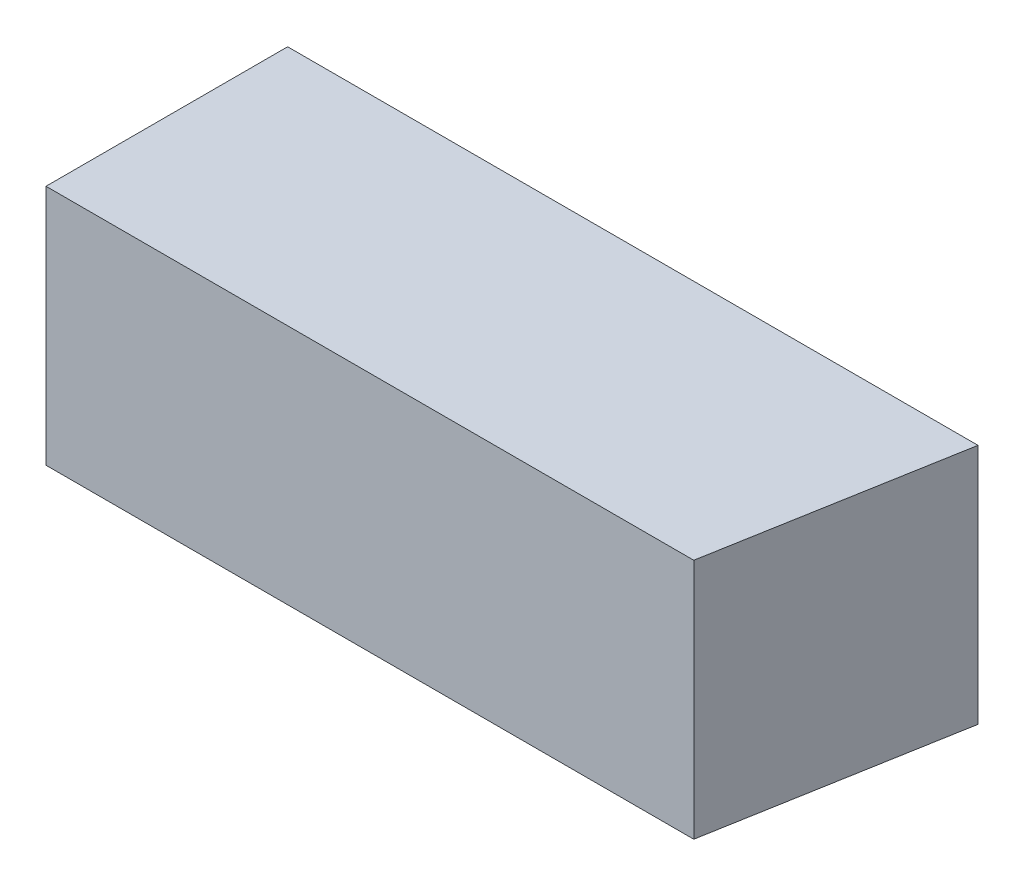
ISO-10303-21;
HEADER;
FILE_DESCRIPTION(('STEP AP214'),'2;1');
FILE_NAME('part.step','',(''),(''),'','','');
FILE_SCHEMA(('AUTOMOTIVE_DESIGN { 1 0 10303 214 1 1 1 1 }'));
ENDSEC;
DATA;
#1=APPLICATION_CONTEXT('core data for automotive mechanical design processes');
#2=APPLICATION_PROTOCOL_DEFINITION('international standard','automotive_design',2000,#1);
#3=PRODUCT_CONTEXT('',#1,'mechanical');
#4=PRODUCT('Part','Part','',(#3));
#5=PRODUCT_RELATED_PRODUCT_CATEGORY('part','',(#4));
#6=PRODUCT_DEFINITION_FORMATION('','',#4);
#7=PRODUCT_DEFINITION_CONTEXT('part definition',#1,'design');
#8=PRODUCT_DEFINITION('design','',#6,#7);
#9=PRODUCT_DEFINITION_SHAPE('','',#8);
#10=(LENGTH_UNIT() NAMED_UNIT(*) SI_UNIT(.MILLI.,.METRE.));
#11=(NAMED_UNIT(*) PLANE_ANGLE_UNIT() SI_UNIT($,.RADIAN.));
#12=(NAMED_UNIT(*) SI_UNIT($,.STERADIAN.) SOLID_ANGLE_UNIT());
#13=UNCERTAINTY_MEASURE_WITH_UNIT(LENGTH_MEASURE(1.E-05),#10,'distance_accuracy_value','');
#14=(GEOMETRIC_REPRESENTATION_CONTEXT(3) GLOBAL_UNCERTAINTY_ASSIGNED_CONTEXT((#13)) GLOBAL_UNIT_ASSIGNED_CONTEXT((#10,
#11,#12)) REPRESENTATION_CONTEXT('',''));
#15=CARTESIAN_POINT('',(0.,0.,0.));
#16=DIRECTION('',(0.,0.,1.));
#17=DIRECTION('',(1.,0.,0.));
#18=AXIS2_PLACEMENT_3D('',#15,#16,#17);
#19=CARTESIAN_POINT('',(254.,0.,0.));
#20=DIRECTION('',(0.,1.,0.));
#21=DIRECTION('',(0.,0.,1.));
#22=AXIS2_PLACEMENT_3D('',#19,#20,#21);
#23=PLANE('',#22);
#24=DIRECTION('',(-0.173622407885694,0.,0.984812296572283));
#25=VECTOR('',#24,1.);
#26=CARTESIAN_POINT('',(254.,0.,0.));
#27=LINE('',#26,#25);
#28=CARTESIAN_POINT('',(254.,0.,0.));
#29=VERTEX_POINT('',#28);
#30=CARTESIAN_POINT('',(238.32693,0.,88.9));
#31=VERTEX_POINT('',#30);
#32=EDGE_CURVE('E63',#29,#31,#27,.T.);
#33=ORIENTED_EDGE('',*,*,#32,.T.);
#34=DIRECTION('',(-1.,0.,0.));
#35=VECTOR('',#34,1.);
#36=CARTESIAN_POINT('',(254.,0.,88.9));
#37=LINE('',#36,#35);
#38=CARTESIAN_POINT('',(0.,0.,88.9));
#39=VERTEX_POINT('',#38);
#40=EDGE_CURVE('E93',#31,#39,#37,.T.);
#41=ORIENTED_EDGE('',*,*,#40,.T.);
#42=DIRECTION('',(0.,0.,-1.));
#43=VECTOR('',#42,1.);
#44=CARTESIAN_POINT('',(0.,0.,0.));
#45=LINE('',#44,#43);
#46=CARTESIAN_POINT('',(0.,0.,0.));
#47=VERTEX_POINT('',#46);
#48=EDGE_CURVE('E106',#39,#47,#45,.T.);
#49=ORIENTED_EDGE('',*,*,#48,.T.);
#50=DIRECTION('',(-1.,0.,0.));
#51=VECTOR('',#50,1.);
#52=CARTESIAN_POINT('',(254.,0.,0.));
#53=LINE('',#52,#51);
#54=EDGE_CURVE('E11',#29,#47,#53,.T.);
#55=ORIENTED_EDGE('',*,*,#54,.F.);
#56=EDGE_LOOP('',(#33,#41,#49,#55));
#57=FACE_BOUND('',#56,.T.);
#58=ADVANCED_FACE('F47',(#57),#23,.F.);
#59=CARTESIAN_POINT('',(254.,88.9,0.));
#60=DIRECTION('',(0.,-1.,0.));
#61=DIRECTION('',(0.,0.,-1.));
#62=AXIS2_PLACEMENT_3D('',#59,#60,#61);
#63=PLANE('',#62);
#64=DIRECTION('',(-0.173622407885694,0.,0.984812296572283));
#65=VECTOR('',#64,1.);
#66=CARTESIAN_POINT('',(254.,88.9,0.));
#67=LINE('',#66,#65);
#68=CARTESIAN_POINT('',(254.,88.9,0.));
#69=VERTEX_POINT('',#68);
#70=CARTESIAN_POINT('',(238.32693,88.9,88.9));
#71=VERTEX_POINT('',#70);
#72=EDGE_CURVE('E121',#69,#71,#67,.T.);
#73=ORIENTED_EDGE('',*,*,#72,.F.);
#74=DIRECTION('',(-1.,0.,0.));
#75=VECTOR('',#74,1.);
#76=CARTESIAN_POINT('',(254.,88.9,0.));
#77=LINE('',#76,#75);
#78=CARTESIAN_POINT('',(0.,88.9,0.));
#79=VERTEX_POINT('',#78);
#80=EDGE_CURVE('E56',#69,#79,#77,.T.);
#81=ORIENTED_EDGE('',*,*,#80,.T.);
#82=DIRECTION('',(0.,0.,1.));
#83=VECTOR('',#82,1.);
#84=CARTESIAN_POINT('',(0.,88.9,0.));
#85=LINE('',#84,#83);
#86=CARTESIAN_POINT('',(0.,88.9,88.9));
#87=VERTEX_POINT('',#86);
#88=EDGE_CURVE('E97',#79,#87,#85,.T.);
#89=ORIENTED_EDGE('',*,*,#88,.T.);
#90=DIRECTION('',(-1.,0.,0.));
#91=VECTOR('',#90,1.);
#92=CARTESIAN_POINT('',(254.,88.9,88.9));
#93=LINE('',#92,#91);
#94=EDGE_CURVE('E82',#71,#87,#93,.T.);
#95=ORIENTED_EDGE('',*,*,#94,.F.);
#96=EDGE_LOOP('',(#73,#81,#89,#95));
#97=FACE_BOUND('',#96,.T.);
#98=ADVANCED_FACE('F98',(#97),#63,.F.);
#99=CARTESIAN_POINT('',(254.,0.,88.9));
#100=DIRECTION('',(0.,0.,-1.));
#101=DIRECTION('',(-1.,0.,0.));
#102=AXIS2_PLACEMENT_3D('',#99,#100,#101);
#103=PLANE('',#102);
#104=DIRECTION('',(0.,-1.,0.));
#105=VECTOR('',#104,1.);
#106=CARTESIAN_POINT('',(238.32693,88.9,88.9));
#107=LINE('',#106,#105);
#108=EDGE_CURVE('E89',#71,#31,#107,.T.);
#109=ORIENTED_EDGE('',*,*,#108,.F.);
#110=ORIENTED_EDGE('',*,*,#94,.T.);
#111=DIRECTION('',(0.,-1.,0.));
#112=VECTOR('',#111,1.);
#113=CARTESIAN_POINT('',(0.,0.,88.9));
#114=LINE('',#113,#112);
#115=EDGE_CURVE('E87',#87,#39,#114,.T.);
#116=ORIENTED_EDGE('',*,*,#115,.T.);
#117=ORIENTED_EDGE('',*,*,#40,.F.);
#118=EDGE_LOOP('',(#109,#110,#116,#117));
#119=FACE_BOUND('',#118,.T.);
#120=ADVANCED_FACE('F84',(#119),#103,.F.);
#121=CARTESIAN_POINT('',(254.,0.,0.));
#122=DIRECTION('',(0.,0.,1.));
#123=DIRECTION('',(1.,0.,0.));
#124=AXIS2_PLACEMENT_3D('',#121,#122,#123);
#125=PLANE('',#124);
#126=DIRECTION('',(0.,1.,0.));
#127=VECTOR('',#126,1.);
#128=CARTESIAN_POINT('',(0.,0.,0.));
#129=LINE('',#128,#127);
#130=EDGE_CURVE('E102',#47,#79,#129,.T.);
#131=ORIENTED_EDGE('',*,*,#130,.T.);
#132=ORIENTED_EDGE('',*,*,#80,.F.);
#133=DIRECTION('',(0.,1.,0.));
#134=VECTOR('',#133,1.);
#135=CARTESIAN_POINT('',(254.,0.,0.));
#136=LINE('',#135,#134);
#137=EDGE_CURVE('E108',#29,#69,#136,.T.);
#138=ORIENTED_EDGE('',*,*,#137,.F.);
#139=ORIENTED_EDGE('',*,*,#54,.T.);
#140=EDGE_LOOP('',(#131,#132,#138,#139));
#141=FACE_BOUND('',#140,.T.);
#142=ADVANCED_FACE('F133',(#141),#125,.F.);
#143=CARTESIAN_POINT('',(0.,0.,0.));
#144=DIRECTION('',(-1.,0.,0.));
#145=DIRECTION('',(0.,0.,1.));
#146=AXIS2_PLACEMENT_3D('',#143,#144,#145);
#147=PLANE('',#146);
#148=ORIENTED_EDGE('',*,*,#48,.F.);
#149=ORIENTED_EDGE('',*,*,#115,.F.);
#150=ORIENTED_EDGE('',*,*,#88,.F.);
#151=ORIENTED_EDGE('',*,*,#130,.F.);
#152=EDGE_LOOP('',(#148,#149,#150,#151));
#153=FACE_BOUND('',#152,.T.);
#154=ADVANCED_FACE('F104',(#153),#147,.T.);
#155=CARTESIAN_POINT('',(254.,88.9,0.));
#156=DIRECTION('',(0.984812296572283,0.,0.173622407885694));
#157=DIRECTION('',(0.173622407885694,0.,-0.984812296572283));
#158=AXIS2_PLACEMENT_3D('',#155,#156,#157);
#159=PLANE('',#158);
#160=ORIENTED_EDGE('',*,*,#32,.F.);
#161=ORIENTED_EDGE('',*,*,#137,.T.);
#162=ORIENTED_EDGE('',*,*,#72,.T.);
#163=ORIENTED_EDGE('',*,*,#108,.T.);
#164=EDGE_LOOP('',(#160,#161,#162,#163));
#165=FACE_BOUND('',#164,.T.);
#166=ADVANCED_FACE('F122',(#165),#159,.T.);
#167=CLOSED_SHELL('',(#58,#98,#120,#142,#154,#166));
#168=MANIFOLD_SOLID_BREP('B2',#167);
#169=ADVANCED_BREP_SHAPE_REPRESENTATION('',(#18,#168),#14);
#170=SHAPE_DEFINITION_REPRESENTATION(#9,#169);
ENDSEC;
END-ISO-10303-21;
